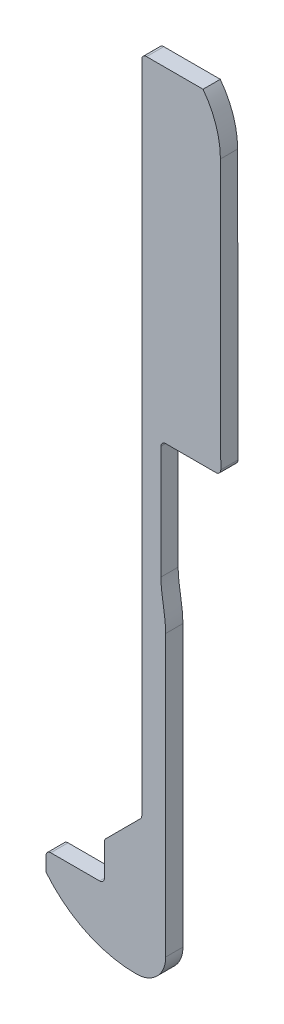
ISO-10303-21;
HEADER;
FILE_DESCRIPTION(('STEP AP214'),'2;1');
FILE_NAME('part.step','',(''),(''),'','','');
FILE_SCHEMA(('AUTOMOTIVE_DESIGN { 1 0 10303 214 1 1 1 1 }'));
ENDSEC;
DATA;
#1=APPLICATION_CONTEXT('core data for automotive mechanical design processes');
#2=APPLICATION_PROTOCOL_DEFINITION('international standard','automotive_design',2000,#1);
#3=PRODUCT_CONTEXT('',#1,'mechanical');
#4=PRODUCT('Part','Part','',(#3));
#5=PRODUCT_RELATED_PRODUCT_CATEGORY('part','',(#4));
#6=PRODUCT_DEFINITION_FORMATION('','',#4);
#7=PRODUCT_DEFINITION_CONTEXT('part definition',#1,'design');
#8=PRODUCT_DEFINITION('design','',#6,#7);
#9=PRODUCT_DEFINITION_SHAPE('','',#8);
#10=(LENGTH_UNIT() NAMED_UNIT(*) SI_UNIT(.MILLI.,.METRE.));
#11=(NAMED_UNIT(*) PLANE_ANGLE_UNIT() SI_UNIT($,.RADIAN.));
#12=(NAMED_UNIT(*) SI_UNIT($,.STERADIAN.) SOLID_ANGLE_UNIT());
#13=UNCERTAINTY_MEASURE_WITH_UNIT(LENGTH_MEASURE(1.E-05),#10,'distance_accuracy_value','');
#14=(GEOMETRIC_REPRESENTATION_CONTEXT(3) GLOBAL_UNCERTAINTY_ASSIGNED_CONTEXT((#13)) GLOBAL_UNIT_ASSIGNED_CONTEXT((#10,
#11,#12)) REPRESENTATION_CONTEXT('',''));
#15=CARTESIAN_POINT('',(0.,0.,0.));
#16=DIRECTION('',(0.,0.,1.));
#17=DIRECTION('',(1.,0.,0.));
#18=AXIS2_PLACEMENT_3D('',#15,#16,#17);
#19=CARTESIAN_POINT('',(9.43,12.1305444444445,1.8));
#20=DIRECTION('',(0.,0.,-1.));
#21=DIRECTION('',(-1.,0.,0.));
#22=AXIS2_PLACEMENT_3D('',#19,#20,#21);
#23=CYLINDRICAL_SURFACE('',#22,12.1305444444445);
#24=CARTESIAN_POINT('',(9.43,12.1305444444445,0.));
#25=DIRECTION('',(0.,0.,1.));
#26=DIRECTION('',(-1.,0.,0.));
#27=AXIS2_PLACEMENT_3D('',#24,#25,#26);
#28=CIRCLE('',#27,12.1305444444445);
#29=CARTESIAN_POINT('',(0.,4.5,0.));
#30=VERTEX_POINT('',#29);
#31=CARTESIAN_POINT('',(9.43,0.,0.));
#32=VERTEX_POINT('',#31);
#33=EDGE_CURVE('E209',#30,#32,#28,.T.);
#34=ORIENTED_EDGE('',*,*,#33,.T.);
#35=DIRECTION('',(0.,0.,-1.));
#36=VECTOR('',#35,1.);
#37=CARTESIAN_POINT('',(9.43,0.,1.8));
#38=LINE('',#37,#36);
#39=CARTESIAN_POINT('',(9.43,0.,1.8));
#40=VERTEX_POINT('',#39);
#41=EDGE_CURVE('E188',#40,#32,#38,.T.);
#42=ORIENTED_EDGE('',*,*,#41,.F.);
#43=CARTESIAN_POINT('',(9.43,12.1305444444445,1.8));
#44=DIRECTION('',(0.,0.,1.));
#45=DIRECTION('',(-1.,0.,0.));
#46=AXIS2_PLACEMENT_3D('',#43,#44,#45);
#47=CIRCLE('',#46,12.1305444444445);
#48=CARTESIAN_POINT('',(0.,4.5,1.8));
#49=VERTEX_POINT('',#48);
#50=EDGE_CURVE('E195',#49,#40,#47,.T.);
#51=ORIENTED_EDGE('',*,*,#50,.F.);
#52=DIRECTION('',(0.,0.,-1.));
#53=VECTOR('',#52,1.);
#54=CARTESIAN_POINT('',(0.,4.5,1.8));
#55=LINE('',#54,#53);
#56=EDGE_CURVE('E364',#49,#30,#55,.T.);
#57=ORIENTED_EDGE('',*,*,#56,.T.);
#58=EDGE_LOOP('',(#34,#42,#51,#57));
#59=FACE_BOUND('',#58,.T.);
#60=ADVANCED_FACE('F39',(#59),#23,.T.);
#61=CARTESIAN_POINT('',(9.43,3.07,1.8));
#62=DIRECTION('',(0.,0.,-1.));
#63=DIRECTION('',(-1.,0.,0.));
#64=AXIS2_PLACEMENT_3D('',#61,#62,#63);
#65=CYLINDRICAL_SURFACE('',#64,3.07);
#66=CARTESIAN_POINT('',(9.43,3.07,0.));
#67=DIRECTION('',(0.,0.,1.));
#68=DIRECTION('',(-1.,0.,0.));
#69=AXIS2_PLACEMENT_3D('',#66,#67,#68);
#70=CIRCLE('',#69,3.07);
#71=CARTESIAN_POINT('',(12.5,3.07,0.));
#72=VERTEX_POINT('',#71);
#73=EDGE_CURVE('E367',#32,#72,#70,.T.);
#74=ORIENTED_EDGE('',*,*,#73,.T.);
#75=DIRECTION('',(0.,0.,-1.));
#76=VECTOR('',#75,1.);
#77=CARTESIAN_POINT('',(12.5,3.07,1.8));
#78=LINE('',#77,#76);
#79=CARTESIAN_POINT('',(12.5,3.07,1.8));
#80=VERTEX_POINT('',#79);
#81=EDGE_CURVE('E191',#80,#72,#78,.T.);
#82=ORIENTED_EDGE('',*,*,#81,.F.);
#83=CARTESIAN_POINT('',(9.43,3.07,1.8));
#84=DIRECTION('',(0.,0.,1.));
#85=DIRECTION('',(-1.,0.,0.));
#86=AXIS2_PLACEMENT_3D('',#83,#84,#85);
#87=CIRCLE('',#86,3.07);
#88=EDGE_CURVE('E184',#40,#80,#87,.T.);
#89=ORIENTED_EDGE('',*,*,#88,.F.);
#90=ORIENTED_EDGE('',*,*,#41,.T.);
#91=EDGE_LOOP('',(#74,#82,#89,#90));
#92=FACE_BOUND('',#91,.T.);
#93=ADVANCED_FACE('F186',(#92),#65,.T.);
#94=CARTESIAN_POINT('',(12.5,32.33,1.8));
#95=DIRECTION('',(-1.,0.,0.));
#96=DIRECTION('',(0.,-1.,0.));
#97=AXIS2_PLACEMENT_3D('',#94,#95,#96);
#98=PLANE('',#97);
#99=DIRECTION('',(0.,1.,0.));
#100=VECTOR('',#99,1.);
#101=CARTESIAN_POINT('',(12.5,32.33,0.));
#102=LINE('',#101,#100);
#103=CARTESIAN_POINT('',(12.5,32.33,0.));
#104=VERTEX_POINT('',#103);
#105=EDGE_CURVE('E370',#72,#104,#102,.T.);
#106=ORIENTED_EDGE('',*,*,#105,.T.);
#107=DIRECTION('',(0.,0.,-1.));
#108=VECTOR('',#107,1.);
#109=CARTESIAN_POINT('',(12.5,32.33,1.8));
#110=LINE('',#109,#108);
#111=CARTESIAN_POINT('',(12.5,32.33,1.8));
#112=VERTEX_POINT('',#111);
#113=EDGE_CURVE('E218',#112,#104,#110,.T.);
#114=ORIENTED_EDGE('',*,*,#113,.F.);
#115=DIRECTION('',(0.,1.,0.));
#116=VECTOR('',#115,1.);
#117=CARTESIAN_POINT('',(12.5,32.33,1.8));
#118=LINE('',#117,#116);
#119=EDGE_CURVE('E194',#80,#112,#118,.T.);
#120=ORIENTED_EDGE('',*,*,#119,.F.);
#121=ORIENTED_EDGE('',*,*,#81,.T.);
#122=EDGE_LOOP('',(#106,#114,#120,#121));
#123=FACE_BOUND('',#122,.T.);
#124=ADVANCED_FACE('F428',(#123),#98,.F.);
#125=CARTESIAN_POINT('',(12.5,32.33,1.8));
#126=CARTESIAN_POINT('',(12.5,33.9722823380889,1.8));
#127=CARTESIAN_POINT('',(12.,35.554764974261,1.8));
#128=CARTESIAN_POINT('',(12.,37.18,1.8));
#129=B_SPLINE_CURVE_WITH_KNOTS('',3,(#125,#126,#127,#128),.UNSPECIFIED.,.F.,.F.,(4,4),(0.,1.),.UNSPECIFIED.);
#130=DIRECTION('',(0.,0.,-1.));
#131=VECTOR('',#130,1.);
#132=SURFACE_OF_LINEAR_EXTRUSION('',#129,#131);
#133=CARTESIAN_POINT('',(12.5,32.33,0.));
#134=CARTESIAN_POINT('',(12.5,33.9722823380889,0.));
#135=CARTESIAN_POINT('',(12.,35.554764974261,0.));
#136=CARTESIAN_POINT('',(12.,37.18,0.));
#137=B_SPLINE_CURVE_WITH_KNOTS('',3,(#133,#134,#135,#136),.UNSPECIFIED.,.F.,.F.,(4,4),(0.,1.),.UNSPECIFIED.);
#138=CARTESIAN_POINT('',(12.,37.18,0.));
#139=VERTEX_POINT('',#138);
#140=EDGE_CURVE('E321',#104,#139,#137,.T.);
#141=ORIENTED_EDGE('',*,*,#140,.T.);
#142=DIRECTION('',(0.,0.,-1.));
#143=VECTOR('',#142,1.);
#144=CARTESIAN_POINT('',(12.,37.18,1.8));
#145=LINE('',#144,#143);
#146=CARTESIAN_POINT('',(12.,37.18,1.8));
#147=VERTEX_POINT('',#146);
#148=EDGE_CURVE('E319',#147,#139,#145,.T.);
#149=ORIENTED_EDGE('',*,*,#148,.F.);
#150=EDGE_CURVE('E339',#112,#147,#129,.T.);
#151=ORIENTED_EDGE('',*,*,#150,.F.);
#152=ORIENTED_EDGE('',*,*,#113,.T.);
#153=EDGE_LOOP('',(#141,#149,#151,#152));
#154=FACE_BOUND('',#153,.T.);
#155=ADVANCED_FACE('F425',(#154),#132,.F.);
#156=CARTESIAN_POINT('',(12.,49.5,1.8));
#157=DIRECTION('',(-1.,0.,0.));
#158=DIRECTION('',(0.,-1.,0.));
#159=AXIS2_PLACEMENT_3D('',#156,#157,#158);
#160=PLANE('',#159);
#161=DIRECTION('',(0.,1.,0.));
#162=VECTOR('',#161,1.);
#163=CARTESIAN_POINT('',(12.,49.5,0.));
#164=LINE('',#163,#162);
#165=CARTESIAN_POINT('',(12.,49.,0.));
#166=VERTEX_POINT('',#165);
#167=EDGE_CURVE('E307',#139,#166,#164,.T.);
#168=ORIENTED_EDGE('',*,*,#167,.T.);
#169=DIRECTION('',(0.,0.,-1.));
#170=VECTOR('',#169,1.);
#171=CARTESIAN_POINT('',(12.,49.,1.8));
#172=LINE('',#171,#170);
#173=CARTESIAN_POINT('',(12.,49.,1.8));
#174=VERTEX_POINT('',#173);
#175=EDGE_CURVE('E285',#166,#174,#172,.F.);
#176=ORIENTED_EDGE('',*,*,#175,.T.);
#177=DIRECTION('',(0.,1.,0.));
#178=VECTOR('',#177,1.);
#179=CARTESIAN_POINT('',(12.,49.5,1.8));
#180=LINE('',#179,#178);
#181=EDGE_CURVE('E328',#147,#174,#180,.T.);
#182=ORIENTED_EDGE('',*,*,#181,.F.);
#183=ORIENTED_EDGE('',*,*,#148,.T.);
#184=EDGE_LOOP('',(#168,#176,#182,#183));
#185=FACE_BOUND('',#184,.T.);
#186=ADVANCED_FACE('F315',(#185),#160,.F.);
#187=CARTESIAN_POINT('',(18.25,49.5,1.8));
#188=DIRECTION('',(0.,1.,0.));
#189=DIRECTION('',(0.,0.,1.));
#190=AXIS2_PLACEMENT_3D('',#187,#188,#189);
#191=PLANE('',#190);
#192=DIRECTION('',(1.,0.,0.));
#193=VECTOR('',#192,1.);
#194=CARTESIAN_POINT('',(18.25,49.5,0.));
#195=LINE('',#194,#193);
#196=CARTESIAN_POINT('',(12.5,49.5,0.));
#197=VERTEX_POINT('',#196);
#198=CARTESIAN_POINT('',(17.7493403583769,49.5,0.));
#199=VERTEX_POINT('',#198);
#200=EDGE_CURVE('E309',#197,#199,#195,.T.);
#201=ORIENTED_EDGE('',*,*,#200,.T.);
#202=DIRECTION('',(0.,0.,-1.));
#203=VECTOR('',#202,1.);
#204=CARTESIAN_POINT('',(17.7493403583769,49.5,1.8));
#205=LINE('',#204,#203);
#206=CARTESIAN_POINT('',(17.7493403583769,49.5,1.8));
#207=VERTEX_POINT('',#206);
#208=EDGE_CURVE('E279',#199,#207,#205,.F.);
#209=ORIENTED_EDGE('',*,*,#208,.T.);
#210=DIRECTION('',(1.,0.,0.));
#211=VECTOR('',#210,1.);
#212=CARTESIAN_POINT('',(18.25,49.5,1.8));
#213=LINE('',#212,#211);
#214=CARTESIAN_POINT('',(12.5,49.5,1.8));
#215=VERTEX_POINT('',#214);
#216=EDGE_CURVE('E326',#215,#207,#213,.T.);
#217=ORIENTED_EDGE('',*,*,#216,.F.);
#218=DIRECTION('',(0.,0.,-1.));
#219=VECTOR('',#218,1.);
#220=CARTESIAN_POINT('',(12.5,49.5,0.));
#221=LINE('',#220,#219);
#222=EDGE_CURVE('E275',#215,#197,#221,.T.);
#223=ORIENTED_EDGE('',*,*,#222,.T.);
#224=EDGE_LOOP('',(#201,#209,#217,#223));
#225=FACE_BOUND('',#224,.T.);
#226=ADVANCED_FACE('F330',(#225),#191,.F.);
#227=CARTESIAN_POINT('',(18.2122992950021,78.0954950668466,1.8));
#228=DIRECTION('',(-0.999999130893212,-0.00131841299280958,0.));
#229=DIRECTION('',(0.00131841299280959,-0.999999130893213,0.));
#230=AXIS2_PLACEMENT_3D('',#227,#228,#229);
#231=PLANE('',#230);
#232=DIRECTION('',(-0.00131841299280958,0.999999130893212,0.));
#233=VECTOR('',#232,1.);
#234=CARTESIAN_POINT('',(18.2122992950021,78.0954950668466,1.8));
#235=LINE('',#234,#233);
#236=CARTESIAN_POINT('',(18.2493399238235,50.0006592064964,1.8));
#237=VERTEX_POINT('',#236);
#238=CARTESIAN_POINT('',(18.2122992950021,78.0954950668466,1.8));
#239=VERTEX_POINT('',#238);
#240=EDGE_CURVE('E333',#237,#239,#235,.T.);
#241=ORIENTED_EDGE('',*,*,#240,.F.);
#242=DIRECTION('',(0.,0.,-1.));
#243=VECTOR('',#242,1.);
#244=CARTESIAN_POINT('',(18.2493399238235,50.0006592064964,1.8));
#245=LINE('',#244,#243);
#246=CARTESIAN_POINT('',(18.2493399238235,50.0006592064964,0.));
#247=VERTEX_POINT('',#246);
#248=EDGE_CURVE('E271',#237,#247,#245,.T.);
#249=ORIENTED_EDGE('',*,*,#248,.T.);
#250=DIRECTION('',(-0.00131841299280958,0.999999130893212,0.));
#251=VECTOR('',#250,1.);
#252=CARTESIAN_POINT('',(18.2122992950021,78.0954950668466,0.));
#253=LINE('',#252,#251);
#254=CARTESIAN_POINT('',(18.2122992950021,78.0954950668466,0.));
#255=VERTEX_POINT('',#254);
#256=EDGE_CURVE('E382',#247,#255,#253,.T.);
#257=ORIENTED_EDGE('',*,*,#256,.T.);
#258=DIRECTION('',(0.,0.,-1.));
#259=VECTOR('',#258,1.);
#260=CARTESIAN_POINT('',(18.2122992950021,78.0954950668466,1.8));
#261=LINE('',#260,#259);
#262=EDGE_CURVE('E415',#239,#255,#261,.T.);
#263=ORIENTED_EDGE('',*,*,#262,.F.);
#264=EDGE_LOOP('',(#241,#249,#257,#263));
#265=FACE_BOUND('',#264,.T.);
#266=ADVANCED_FACE('F527',(#265),#231,.F.);
#267=CARTESIAN_POINT('',(9.2123071169632,78.0836293499113,1.8));
#268=DIRECTION('',(0.,0.,-1.));
#269=DIRECTION('',(-1.,0.,0.));
#270=AXIS2_PLACEMENT_3D('',#267,#268,#269);
#271=CYLINDRICAL_SURFACE('',#270,9.);
#272=CARTESIAN_POINT('',(9.2123071169632,78.0836293499113,0.));
#273=DIRECTION('',(0.,0.,1.));
#274=DIRECTION('',(-1.,0.,0.));
#275=AXIS2_PLACEMENT_3D('',#272,#273,#274);
#276=CIRCLE('',#275,9.);
#277=CARTESIAN_POINT('',(16.4,83.5,0.));
#278=VERTEX_POINT('',#277);
#279=EDGE_CURVE('E385',#255,#278,#276,.T.);
#280=ORIENTED_EDGE('',*,*,#279,.T.);
#281=DIRECTION('',(0.,0.,-1.));
#282=VECTOR('',#281,1.);
#283=CARTESIAN_POINT('',(16.4,83.5,1.8));
#284=LINE('',#283,#282);
#285=CARTESIAN_POINT('',(16.4,83.5,1.8));
#286=VERTEX_POINT('',#285);
#287=EDGE_CURVE('E411',#286,#278,#284,.T.);
#288=ORIENTED_EDGE('',*,*,#287,.F.);
#289=CARTESIAN_POINT('',(9.2123071169632,78.0836293499113,1.8));
#290=DIRECTION('',(0.,0.,1.));
#291=DIRECTION('',(-1.,0.,0.));
#292=AXIS2_PLACEMENT_3D('',#289,#290,#291);
#293=CIRCLE('',#292,9.);
#294=EDGE_CURVE('E337',#239,#286,#293,.T.);
#295=ORIENTED_EDGE('',*,*,#294,.F.);
#296=ORIENTED_EDGE('',*,*,#262,.T.);
#297=EDGE_LOOP('',(#280,#288,#295,#296));
#298=FACE_BOUND('',#297,.T.);
#299=ADVANCED_FACE('F523',(#298),#271,.T.);
#300=CARTESIAN_POINT('',(10.,83.5,1.8));
#301=DIRECTION('',(0.,-1.,0.));
#302=DIRECTION('',(0.,0.,-1.));
#303=AXIS2_PLACEMENT_3D('',#300,#301,#302);
#304=PLANE('',#303);
#305=DIRECTION('',(-1.,0.,0.));
#306=VECTOR('',#305,1.);
#307=CARTESIAN_POINT('',(10.,83.5,0.));
#308=LINE('',#307,#306);
#309=CARTESIAN_POINT('',(10.5,83.5,0.));
#310=VERTEX_POINT('',#309);
#311=EDGE_CURVE('E388',#278,#310,#308,.T.);
#312=ORIENTED_EDGE('',*,*,#311,.T.);
#313=DIRECTION('',(0.,0.,-1.));
#314=VECTOR('',#313,1.);
#315=CARTESIAN_POINT('',(10.5,83.5,1.8));
#316=LINE('',#315,#314);
#317=CARTESIAN_POINT('',(10.5,83.5,1.8));
#318=VERTEX_POINT('',#317);
#319=EDGE_CURVE('E282',#310,#318,#316,.F.);
#320=ORIENTED_EDGE('',*,*,#319,.T.);
#321=DIRECTION('',(-1.,0.,0.));
#322=VECTOR('',#321,1.);
#323=CARTESIAN_POINT('',(10.,83.5,1.8));
#324=LINE('',#323,#322);
#325=EDGE_CURVE('E345',#286,#318,#324,.T.);
#326=ORIENTED_EDGE('',*,*,#325,.F.);
#327=ORIENTED_EDGE('',*,*,#287,.T.);
#328=EDGE_LOOP('',(#312,#320,#326,#327));
#329=FACE_BOUND('',#328,.T.);
#330=ADVANCED_FACE('F520',(#329),#304,.F.);
#331=CARTESIAN_POINT('',(10.,14.4,1.8));
#332=DIRECTION('',(1.,0.,0.));
#333=DIRECTION('',(0.,0.,-1.));
#334=AXIS2_PLACEMENT_3D('',#331,#332,#333);
#335=PLANE('',#334);
#336=DIRECTION('',(0.,-1.,0.));
#337=VECTOR('',#336,1.);
#338=CARTESIAN_POINT('',(10.,14.4,0.));
#339=LINE('',#338,#337);
#340=CARTESIAN_POINT('',(10.,83.,0.));
#341=VERTEX_POINT('',#340);
#342=CARTESIAN_POINT('',(10.,14.6071067811865,0.));
#343=VERTEX_POINT('',#342);
#344=EDGE_CURVE('E392',#341,#343,#339,.T.);
#345=ORIENTED_EDGE('',*,*,#344,.T.);
#346=DIRECTION('',(0.,0.,-1.));
#347=VECTOR('',#346,1.);
#348=CARTESIAN_POINT('',(10.,14.6071067811865,1.8));
#349=LINE('',#348,#347);
#350=CARTESIAN_POINT('',(10.,14.6071067811865,1.8));
#351=VERTEX_POINT('',#350);
#352=EDGE_CURVE('E268',#343,#351,#349,.F.);
#353=ORIENTED_EDGE('',*,*,#352,.T.);
#354=DIRECTION('',(0.,-1.,0.));
#355=VECTOR('',#354,1.);
#356=CARTESIAN_POINT('',(10.,14.4,1.8));
#357=LINE('',#356,#355);
#358=CARTESIAN_POINT('',(10.,83.,1.8));
#359=VERTEX_POINT('',#358);
#360=EDGE_CURVE('E349',#359,#351,#357,.T.);
#361=ORIENTED_EDGE('',*,*,#360,.F.);
#362=DIRECTION('',(0.,0.,-1.));
#363=VECTOR('',#362,1.);
#364=CARTESIAN_POINT('',(10.,83.,1.8));
#365=LINE('',#364,#363);
#366=EDGE_CURVE('E264',#359,#341,#365,.T.);
#367=ORIENTED_EDGE('',*,*,#366,.T.);
#368=EDGE_LOOP('',(#345,#353,#361,#367));
#369=FACE_BOUND('',#368,.T.);
#370=ADVANCED_FACE('F481',(#369),#335,.F.);
#371=CARTESIAN_POINT('',(6.1,10.5,1.8));
#372=DIRECTION('',(0.707106781186546,-0.707106781186549,0.));
#373=DIRECTION('',(0.707106781186549,0.707106781186546,0.));
#374=AXIS2_PLACEMENT_3D('',#371,#372,#373);
#375=PLANE('',#374);
#376=DIRECTION('',(-0.707106781186549,-0.707106781186546,0.));
#377=VECTOR('',#376,1.);
#378=CARTESIAN_POINT('',(6.1,10.5,0.));
#379=LINE('',#378,#377);
#380=CARTESIAN_POINT('',(9.85355339059327,14.2535533905933,0.));
#381=VERTEX_POINT('',#380);
#382=CARTESIAN_POINT('',(6.24644660940673,10.6464466094067,0.));
#383=VERTEX_POINT('',#382);
#384=EDGE_CURVE('E396',#381,#383,#379,.T.);
#385=ORIENTED_EDGE('',*,*,#384,.T.);
#386=DIRECTION('',(0.,0.,-1.));
#387=VECTOR('',#386,1.);
#388=CARTESIAN_POINT('',(6.24644660940673,10.6464466094067,1.8));
#389=LINE('',#388,#387);
#390=CARTESIAN_POINT('',(6.24644660940673,10.6464466094067,1.8));
#391=VERTEX_POINT('',#390);
#392=EDGE_CURVE('E261',#383,#391,#389,.F.);
#393=ORIENTED_EDGE('',*,*,#392,.T.);
#394=DIRECTION('',(-0.707106781186549,-0.707106781186546,0.));
#395=VECTOR('',#394,1.);
#396=CARTESIAN_POINT('',(6.1,10.5,1.8));
#397=LINE('',#396,#395);
#398=CARTESIAN_POINT('',(9.85355339059327,14.2535533905933,1.8));
#399=VERTEX_POINT('',#398);
#400=EDGE_CURVE('E353',#399,#391,#397,.T.);
#401=ORIENTED_EDGE('',*,*,#400,.F.);
#402=DIRECTION('',(0.,0.,-1.));
#403=VECTOR('',#402,1.);
#404=CARTESIAN_POINT('',(9.85355339059327,14.2535533905933,0.));
#405=LINE('',#404,#403);
#406=EDGE_CURVE('E257',#399,#381,#405,.T.);
#407=ORIENTED_EDGE('',*,*,#406,.T.);
#408=EDGE_LOOP('',(#385,#393,#401,#407));
#409=FACE_BOUND('',#408,.T.);
#410=ADVANCED_FACE('F487',(#409),#375,.F.);
#411=CARTESIAN_POINT('',(6.1,6.5,1.8));
#412=DIRECTION('',(1.,0.,0.));
#413=DIRECTION('',(0.,0.,-1.));
#414=AXIS2_PLACEMENT_3D('',#411,#412,#413);
#415=PLANE('',#414);
#416=DIRECTION('',(0.,-1.,0.));
#417=VECTOR('',#416,1.);
#418=CARTESIAN_POINT('',(6.1,6.5,0.));
#419=LINE('',#418,#417);
#420=CARTESIAN_POINT('',(6.1,10.2928932188135,0.));
#421=VERTEX_POINT('',#420);
#422=CARTESIAN_POINT('',(6.1,7.,0.));
#423=VERTEX_POINT('',#422);
#424=EDGE_CURVE('E400',#421,#423,#419,.T.);
#425=ORIENTED_EDGE('',*,*,#424,.T.);
#426=DIRECTION('',(0.,0.,-1.));
#427=VECTOR('',#426,1.);
#428=CARTESIAN_POINT('',(6.1,7.,1.8));
#429=LINE('',#428,#427);
#430=CARTESIAN_POINT('',(6.1,7.,1.8));
#431=VERTEX_POINT('',#430);
#432=EDGE_CURVE('E55',#423,#431,#429,.F.);
#433=ORIENTED_EDGE('',*,*,#432,.T.);
#434=DIRECTION('',(0.,-1.,0.));
#435=VECTOR('',#434,1.);
#436=CARTESIAN_POINT('',(6.1,6.5,1.8));
#437=LINE('',#436,#435);
#438=CARTESIAN_POINT('',(6.1,10.2928932188135,1.8));
#439=VERTEX_POINT('',#438);
#440=EDGE_CURVE('E356',#439,#431,#437,.T.);
#441=ORIENTED_EDGE('',*,*,#440,.F.);
#442=DIRECTION('',(0.,0.,-1.));
#443=VECTOR('',#442,1.);
#444=CARTESIAN_POINT('',(6.1,10.2928932188135,1.8));
#445=LINE('',#444,#443);
#446=EDGE_CURVE('E251',#439,#421,#445,.T.);
#447=ORIENTED_EDGE('',*,*,#446,.T.);
#448=EDGE_LOOP('',(#425,#433,#441,#447));
#449=FACE_BOUND('',#448,.T.);
#450=ADVANCED_FACE('F492',(#449),#415,.F.);
#451=CARTESIAN_POINT('',(0.,6.5,1.8));
#452=DIRECTION('',(0.,-1.,0.));
#453=DIRECTION('',(0.,0.,-1.));
#454=AXIS2_PLACEMENT_3D('',#451,#452,#453);
#455=PLANE('',#454);
#456=DIRECTION('',(-1.,0.,0.));
#457=VECTOR('',#456,1.);
#458=CARTESIAN_POINT('',(0.,6.5,0.));
#459=LINE('',#458,#457);
#460=CARTESIAN_POINT('',(5.6,6.5,0.));
#461=VERTEX_POINT('',#460);
#462=CARTESIAN_POINT('',(0.5,6.5,0.));
#463=VERTEX_POINT('',#462);
#464=EDGE_CURVE('E403',#461,#463,#459,.T.);
#465=ORIENTED_EDGE('',*,*,#464,.T.);
#466=DIRECTION('',(0.,0.,-1.));
#467=VECTOR('',#466,1.);
#468=CARTESIAN_POINT('',(0.5,6.5,1.8));
#469=LINE('',#468,#467);
#470=CARTESIAN_POINT('',(0.5,6.5,1.8));
#471=VERTEX_POINT('',#470);
#472=EDGE_CURVE('E237',#463,#471,#469,.F.);
#473=ORIENTED_EDGE('',*,*,#472,.T.);
#474=DIRECTION('',(-1.,0.,0.));
#475=VECTOR('',#474,1.);
#476=CARTESIAN_POINT('',(0.,6.5,1.8));
#477=LINE('',#476,#475);
#478=CARTESIAN_POINT('',(5.6,6.5,1.8));
#479=VERTEX_POINT('',#478);
#480=EDGE_CURVE('E359',#479,#471,#477,.T.);
#481=ORIENTED_EDGE('',*,*,#480,.F.);
#482=DIRECTION('',(0.,0.,-1.));
#483=VECTOR('',#482,1.);
#484=CARTESIAN_POINT('',(5.6,6.5,0.));
#485=LINE('',#484,#483);
#486=EDGE_CURVE('E233',#479,#461,#485,.T.);
#487=ORIENTED_EDGE('',*,*,#486,.T.);
#488=EDGE_LOOP('',(#465,#473,#481,#487));
#489=FACE_BOUND('',#488,.T.);
#490=ADVANCED_FACE('F498',(#489),#455,.F.);
#491=CARTESIAN_POINT('',(0.,4.5,1.8));
#492=DIRECTION('',(1.,0.,0.));
#493=DIRECTION('',(0.,0.,-1.));
#494=AXIS2_PLACEMENT_3D('',#491,#492,#493);
#495=PLANE('',#494);
#496=DIRECTION('',(0.,-1.,0.));
#497=VECTOR('',#496,1.);
#498=CARTESIAN_POINT('',(0.,4.5,1.8));
#499=LINE('',#498,#497);
#500=CARTESIAN_POINT('',(0.,6.,1.8));
#501=VERTEX_POINT('',#500);
#502=EDGE_CURVE('E201',#501,#49,#499,.T.);
#503=ORIENTED_EDGE('',*,*,#502,.F.);
#504=DIRECTION('',(0.,0.,-1.));
#505=VECTOR('',#504,1.);
#506=CARTESIAN_POINT('',(0.,6.,1.8));
#507=LINE('',#506,#505);
#508=CARTESIAN_POINT('',(0.,6.,0.));
#509=VERTEX_POINT('',#508);
#510=EDGE_CURVE('E211',#501,#509,#507,.T.);
#511=ORIENTED_EDGE('',*,*,#510,.T.);
#512=DIRECTION('',(0.,-1.,0.));
#513=VECTOR('',#512,1.);
#514=CARTESIAN_POINT('',(0.,4.5,0.));
#515=LINE('',#514,#513);
#516=EDGE_CURVE('E206',#509,#30,#515,.T.);
#517=ORIENTED_EDGE('',*,*,#516,.T.);
#518=ORIENTED_EDGE('',*,*,#56,.F.);
#519=EDGE_LOOP('',(#503,#511,#517,#518));
#520=FACE_BOUND('',#519,.T.);
#521=ADVANCED_FACE('F503',(#520),#495,.F.);
#522=CARTESIAN_POINT('',(9.43,12.1305444444445,1.8));
#523=DIRECTION('',(0.,0.,-1.));
#524=DIRECTION('',(-1.,0.,0.));
#525=AXIS2_PLACEMENT_3D('',#522,#523,#524);
#526=PLANE('',#525);
#527=ORIENTED_EDGE('',*,*,#480,.T.);
#528=CARTESIAN_POINT('',(0.5,6.,1.8));
#529=DIRECTION('',(0.,0.,-1.));
#530=DIRECTION('',(-1.,0.,0.));
#531=AXIS2_PLACEMENT_3D('',#528,#529,#530);
#532=CIRCLE('',#531,0.5);
#533=EDGE_CURVE('E248',#471,#501,#532,.F.);
#534=ORIENTED_EDGE('',*,*,#533,.T.);
#535=ORIENTED_EDGE('',*,*,#502,.T.);
#536=ORIENTED_EDGE('',*,*,#50,.T.);
#537=ORIENTED_EDGE('',*,*,#88,.T.);
#538=ORIENTED_EDGE('',*,*,#119,.T.);
#539=ORIENTED_EDGE('',*,*,#150,.T.);
#540=ORIENTED_EDGE('',*,*,#181,.T.);
#541=CARTESIAN_POINT('',(12.5,49.,1.8));
#542=DIRECTION('',(0.,0.,-1.));
#543=DIRECTION('',(-1.,0.,0.));
#544=AXIS2_PLACEMENT_3D('',#541,#542,#543);
#545=CIRCLE('',#544,0.5);
#546=EDGE_CURVE('E11',#174,#215,#545,.T.);
#547=ORIENTED_EDGE('',*,*,#546,.T.);
#548=ORIENTED_EDGE('',*,*,#216,.T.);
#549=CARTESIAN_POINT('',(17.7493403583769,50.,1.8));
#550=DIRECTION('',(0.,0.,-1.));
#551=DIRECTION('',(-1.,0.,0.));
#552=AXIS2_PLACEMENT_3D('',#549,#550,#551);
#553=CIRCLE('',#552,0.5);
#554=EDGE_CURVE('E243',#207,#237,#553,.F.);
#555=ORIENTED_EDGE('',*,*,#554,.T.);
#556=ORIENTED_EDGE('',*,*,#240,.T.);
#557=ORIENTED_EDGE('',*,*,#294,.T.);
#558=ORIENTED_EDGE('',*,*,#325,.T.);
#559=CARTESIAN_POINT('',(10.5,83.,1.8));
#560=DIRECTION('',(0.,0.,-1.));
#561=DIRECTION('',(-1.,0.,0.));
#562=AXIS2_PLACEMENT_3D('',#559,#560,#561);
#563=CIRCLE('',#562,0.5);
#564=EDGE_CURVE('E240',#318,#359,#563,.F.);
#565=ORIENTED_EDGE('',*,*,#564,.T.);
#566=ORIENTED_EDGE('',*,*,#360,.T.);
#567=CARTESIAN_POINT('',(9.5,14.6071067811865,1.8));
#568=DIRECTION('',(0.,0.,-1.));
#569=DIRECTION('',(-1.,0.,0.));
#570=AXIS2_PLACEMENT_3D('',#567,#568,#569);
#571=CIRCLE('',#570,0.5);
#572=EDGE_CURVE('E297',#351,#399,#571,.T.);
#573=ORIENTED_EDGE('',*,*,#572,.T.);
#574=ORIENTED_EDGE('',*,*,#400,.T.);
#575=CARTESIAN_POINT('',(6.6,10.2928932188135,1.8));
#576=DIRECTION('',(0.,0.,-1.));
#577=DIRECTION('',(-1.,0.,0.));
#578=AXIS2_PLACEMENT_3D('',#575,#576,#577);
#579=CIRCLE('',#578,0.5);
#580=EDGE_CURVE('E62',#391,#439,#579,.F.);
#581=ORIENTED_EDGE('',*,*,#580,.T.);
#582=ORIENTED_EDGE('',*,*,#440,.T.);
#583=CARTESIAN_POINT('',(5.6,7.,1.8));
#584=DIRECTION('',(0.,0.,-1.));
#585=DIRECTION('',(-1.,0.,0.));
#586=AXIS2_PLACEMENT_3D('',#583,#584,#585);
#587=CIRCLE('',#586,0.5);
#588=EDGE_CURVE('E291',#431,#479,#587,.T.);
#589=ORIENTED_EDGE('',*,*,#588,.T.);
#590=EDGE_LOOP('',(#527,#534,#535,#536,#537,#538,#539,#540,#547,#548,#555,#556,#557,#558,#565,
#566,#573,#574,#581,#582,#589));
#591=FACE_BOUND('',#590,.T.);
#592=ADVANCED_FACE('F199',(#591),#526,.F.);
#593=CARTESIAN_POINT('',(9.43,12.1305444444445,0.));
#594=DIRECTION('',(0.,0.,-1.));
#595=DIRECTION('',(-1.,0.,0.));
#596=AXIS2_PLACEMENT_3D('',#593,#594,#595);
#597=PLANE('',#596);
#598=ORIENTED_EDGE('',*,*,#516,.F.);
#599=CARTESIAN_POINT('',(0.5,6.,0.));
#600=DIRECTION('',(0.,0.,-1.));
#601=DIRECTION('',(-1.,0.,0.));
#602=AXIS2_PLACEMENT_3D('',#599,#600,#601);
#603=CIRCLE('',#602,0.5);
#604=EDGE_CURVE('E230',#509,#463,#603,.T.);
#605=ORIENTED_EDGE('',*,*,#604,.T.);
#606=ORIENTED_EDGE('',*,*,#464,.F.);
#607=CARTESIAN_POINT('',(5.6,7.,0.));
#608=DIRECTION('',(0.,0.,-1.));
#609=DIRECTION('',(-1.,0.,0.));
#610=AXIS2_PLACEMENT_3D('',#607,#608,#609);
#611=CIRCLE('',#610,0.5);
#612=EDGE_CURVE('E288',#461,#423,#611,.F.);
#613=ORIENTED_EDGE('',*,*,#612,.T.);
#614=ORIENTED_EDGE('',*,*,#424,.F.);
#615=CARTESIAN_POINT('',(6.6,10.2928932188135,0.));
#616=DIRECTION('',(0.,0.,-1.));
#617=DIRECTION('',(-1.,0.,0.));
#618=AXIS2_PLACEMENT_3D('',#615,#616,#617);
#619=CIRCLE('',#618,0.5);
#620=EDGE_CURVE('E227',#421,#383,#619,.T.);
#621=ORIENTED_EDGE('',*,*,#620,.T.);
#622=ORIENTED_EDGE('',*,*,#384,.F.);
#623=CARTESIAN_POINT('',(9.5,14.6071067811865,0.));
#624=DIRECTION('',(0.,0.,-1.));
#625=DIRECTION('',(-1.,0.,0.));
#626=AXIS2_PLACEMENT_3D('',#623,#624,#625);
#627=CIRCLE('',#626,0.5);
#628=EDGE_CURVE('E294',#381,#343,#627,.F.);
#629=ORIENTED_EDGE('',*,*,#628,.T.);
#630=ORIENTED_EDGE('',*,*,#344,.F.);
#631=CARTESIAN_POINT('',(10.5,83.,0.));
#632=DIRECTION('',(0.,0.,-1.));
#633=DIRECTION('',(-1.,0.,0.));
#634=AXIS2_PLACEMENT_3D('',#631,#632,#633);
#635=CIRCLE('',#634,0.5);
#636=EDGE_CURVE('E216',#341,#310,#635,.T.);
#637=ORIENTED_EDGE('',*,*,#636,.T.);
#638=ORIENTED_EDGE('',*,*,#311,.F.);
#639=ORIENTED_EDGE('',*,*,#279,.F.);
#640=ORIENTED_EDGE('',*,*,#256,.F.);
#641=CARTESIAN_POINT('',(17.7493403583769,50.,0.));
#642=DIRECTION('',(0.,0.,-1.));
#643=DIRECTION('',(-1.,0.,0.));
#644=AXIS2_PLACEMENT_3D('',#641,#642,#643);
#645=CIRCLE('',#644,0.5);
#646=EDGE_CURVE('E224',#247,#199,#645,.T.);
#647=ORIENTED_EDGE('',*,*,#646,.T.);
#648=ORIENTED_EDGE('',*,*,#200,.F.);
#649=CARTESIAN_POINT('',(12.5,49.,0.));
#650=DIRECTION('',(0.,0.,-1.));
#651=DIRECTION('',(-1.,0.,0.));
#652=AXIS2_PLACEMENT_3D('',#649,#650,#651);
#653=CIRCLE('',#652,0.5);
#654=EDGE_CURVE('E48',#197,#166,#653,.F.);
#655=ORIENTED_EDGE('',*,*,#654,.T.);
#656=ORIENTED_EDGE('',*,*,#167,.F.);
#657=ORIENTED_EDGE('',*,*,#140,.F.);
#658=ORIENTED_EDGE('',*,*,#105,.F.);
#659=ORIENTED_EDGE('',*,*,#73,.F.);
#660=ORIENTED_EDGE('',*,*,#33,.F.);
#661=EDGE_LOOP('',(#598,#605,#606,#613,#614,#621,#622,#629,#630,#637,#638,#639,#640,#647,#648,
#655,#656,#657,#658,#659,#660));
#662=FACE_BOUND('',#661,.T.);
#663=ADVANCED_FACE('F305',(#662),#597,.T.);
#664=CARTESIAN_POINT('',(0.5,6.,1.8));
#665=DIRECTION('',(0.,0.,-1.));
#666=DIRECTION('',(-1.,0.,0.));
#667=AXIS2_PLACEMENT_3D('',#664,#665,#666);
#668=CYLINDRICAL_SURFACE('',#667,0.5);
#669=ORIENTED_EDGE('',*,*,#533,.F.);
#670=ORIENTED_EDGE('',*,*,#472,.F.);
#671=ORIENTED_EDGE('',*,*,#604,.F.);
#672=ORIENTED_EDGE('',*,*,#510,.F.);
#673=EDGE_LOOP('',(#669,#670,#671,#672));
#674=FACE_BOUND('',#673,.T.);
#675=ADVANCED_FACE('F449',(#674),#668,.T.);
#676=CARTESIAN_POINT('',(5.6,7.,1.8));
#677=DIRECTION('',(0.,0.,1.));
#678=DIRECTION('',(1.,0.,0.));
#679=AXIS2_PLACEMENT_3D('',#676,#677,#678);
#680=CYLINDRICAL_SURFACE('',#679,0.5);
#681=ORIENTED_EDGE('',*,*,#588,.F.);
#682=ORIENTED_EDGE('',*,*,#432,.F.);
#683=ORIENTED_EDGE('',*,*,#612,.F.);
#684=ORIENTED_EDGE('',*,*,#486,.F.);
#685=EDGE_LOOP('',(#681,#682,#683,#684));
#686=FACE_BOUND('',#685,.T.);
#687=ADVANCED_FACE('F452',(#686),#680,.F.);
#688=CARTESIAN_POINT('',(6.6,10.2928932188135,1.8));
#689=DIRECTION('',(0.,0.,-1.));
#690=DIRECTION('',(-1.,0.,0.));
#691=AXIS2_PLACEMENT_3D('',#688,#689,#690);
#692=CYLINDRICAL_SURFACE('',#691,0.5);
#693=ORIENTED_EDGE('',*,*,#580,.F.);
#694=ORIENTED_EDGE('',*,*,#392,.F.);
#695=ORIENTED_EDGE('',*,*,#620,.F.);
#696=ORIENTED_EDGE('',*,*,#446,.F.);
#697=EDGE_LOOP('',(#693,#694,#695,#696));
#698=FACE_BOUND('',#697,.T.);
#699=ADVANCED_FACE('F456',(#698),#692,.T.);
#700=CARTESIAN_POINT('',(9.5,14.6071067811865,1.8));
#701=DIRECTION('',(0.,0.,1.));
#702=DIRECTION('',(1.,0.,0.));
#703=AXIS2_PLACEMENT_3D('',#700,#701,#702);
#704=CYLINDRICAL_SURFACE('',#703,0.5);
#705=ORIENTED_EDGE('',*,*,#572,.F.);
#706=ORIENTED_EDGE('',*,*,#352,.F.);
#707=ORIENTED_EDGE('',*,*,#628,.F.);
#708=ORIENTED_EDGE('',*,*,#406,.F.);
#709=EDGE_LOOP('',(#705,#706,#707,#708));
#710=FACE_BOUND('',#709,.T.);
#711=ADVANCED_FACE('F460',(#710),#704,.F.);
#712=CARTESIAN_POINT('',(17.7493403583769,50.,1.8));
#713=DIRECTION('',(0.,0.,-1.));
#714=DIRECTION('',(-1.,0.,0.));
#715=AXIS2_PLACEMENT_3D('',#712,#713,#714);
#716=CYLINDRICAL_SURFACE('',#715,0.5);
#717=ORIENTED_EDGE('',*,*,#554,.F.);
#718=ORIENTED_EDGE('',*,*,#208,.F.);
#719=ORIENTED_EDGE('',*,*,#646,.F.);
#720=ORIENTED_EDGE('',*,*,#248,.F.);
#721=EDGE_LOOP('',(#717,#718,#719,#720));
#722=FACE_BOUND('',#721,.T.);
#723=ADVANCED_FACE('F464',(#722),#716,.T.);
#724=CARTESIAN_POINT('',(10.5,83.,1.8));
#725=DIRECTION('',(0.,0.,-1.));
#726=DIRECTION('',(-1.,0.,0.));
#727=AXIS2_PLACEMENT_3D('',#724,#725,#726);
#728=CYLINDRICAL_SURFACE('',#727,0.5);
#729=ORIENTED_EDGE('',*,*,#564,.F.);
#730=ORIENTED_EDGE('',*,*,#319,.F.);
#731=ORIENTED_EDGE('',*,*,#636,.F.);
#732=ORIENTED_EDGE('',*,*,#366,.F.);
#733=EDGE_LOOP('',(#729,#730,#731,#732));
#734=FACE_BOUND('',#733,.T.);
#735=ADVANCED_FACE('F467',(#734),#728,.T.);
#736=CARTESIAN_POINT('',(12.5,49.,1.8));
#737=DIRECTION('',(0.,0.,1.));
#738=DIRECTION('',(1.,0.,0.));
#739=AXIS2_PLACEMENT_3D('',#736,#737,#738);
#740=CYLINDRICAL_SURFACE('',#739,0.5);
#741=ORIENTED_EDGE('',*,*,#546,.F.);
#742=ORIENTED_EDGE('',*,*,#175,.F.);
#743=ORIENTED_EDGE('',*,*,#654,.F.);
#744=ORIENTED_EDGE('',*,*,#222,.F.);
#745=EDGE_LOOP('',(#741,#742,#743,#744));
#746=FACE_BOUND('',#745,.T.);
#747=ADVANCED_FACE('F41',(#746),#740,.F.);
#748=CLOSED_SHELL('',(#60,#93,#124,#155,#186,#226,#266,#299,#330,#370,#410,#450,#490,#521,#592,
#663,#675,#687,#699,#711,#723,#735,#747));
#749=MANIFOLD_SOLID_BREP('B2',#748);
#750=ADVANCED_BREP_SHAPE_REPRESENTATION('',(#18,#749),#14);
#751=SHAPE_DEFINITION_REPRESENTATION(#9,#750);
ENDSEC;
END-ISO-10303-21;
